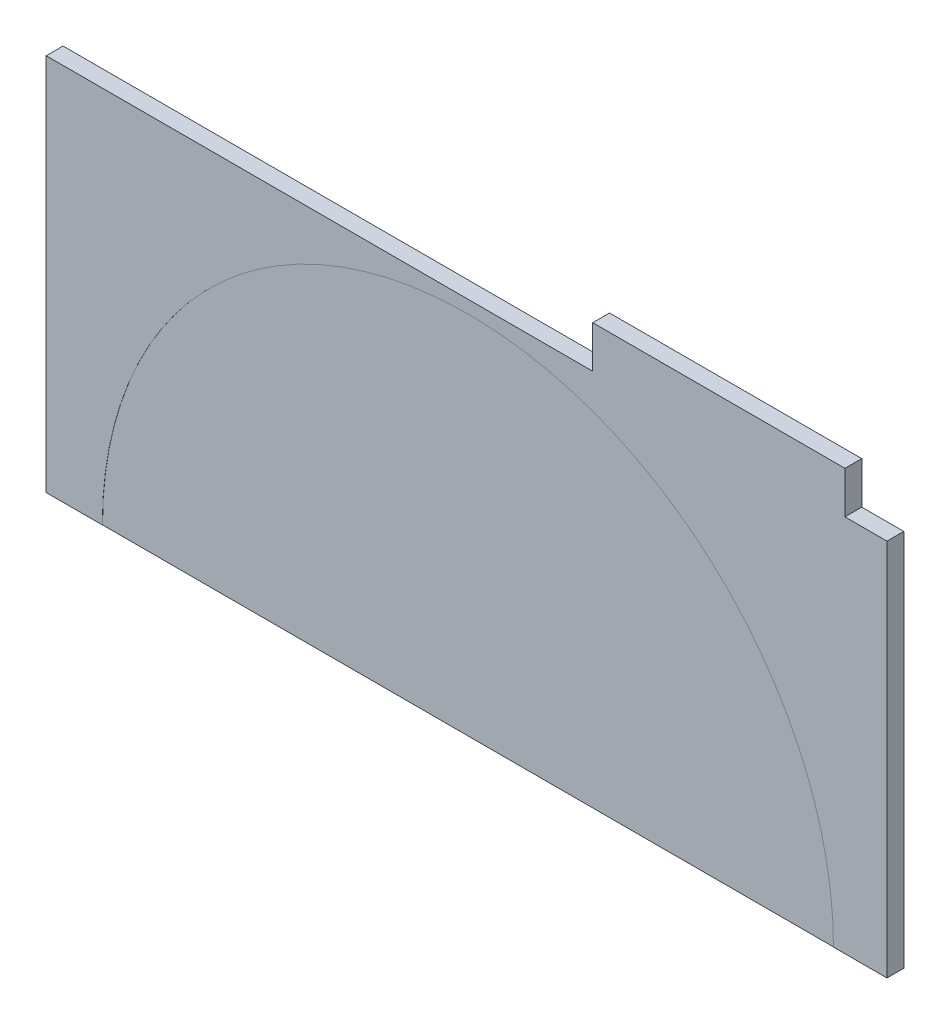
ISO-10303-21;
HEADER;
FILE_DESCRIPTION(('STEP AP214'),'2;1');
FILE_NAME('part.step','',(''),(''),'','','');
FILE_SCHEMA(('AUTOMOTIVE_DESIGN { 1 0 10303 214 1 1 1 1 }'));
ENDSEC;
DATA;
#1=APPLICATION_CONTEXT('core data for automotive mechanical design processes');
#2=APPLICATION_PROTOCOL_DEFINITION('international standard','automotive_design',2000,#1);
#3=PRODUCT_CONTEXT('',#1,'mechanical');
#4=PRODUCT('Part','Part','',(#3));
#5=PRODUCT_RELATED_PRODUCT_CATEGORY('part','',(#4));
#6=PRODUCT_DEFINITION_FORMATION('','',#4);
#7=PRODUCT_DEFINITION_CONTEXT('part definition',#1,'design');
#8=PRODUCT_DEFINITION('design','',#6,#7);
#9=PRODUCT_DEFINITION_SHAPE('','',#8);
#10=(LENGTH_UNIT() NAMED_UNIT(*) SI_UNIT(.MILLI.,.METRE.));
#11=(NAMED_UNIT(*) PLANE_ANGLE_UNIT() SI_UNIT($,.RADIAN.));
#12=(NAMED_UNIT(*) SI_UNIT($,.STERADIAN.) SOLID_ANGLE_UNIT());
#13=UNCERTAINTY_MEASURE_WITH_UNIT(LENGTH_MEASURE(1.E-05),#10,'distance_accuracy_value','');
#14=(GEOMETRIC_REPRESENTATION_CONTEXT(3) GLOBAL_UNCERTAINTY_ASSIGNED_CONTEXT((#13)) GLOBAL_UNIT_ASSIGNED_CONTEXT((#10,
#11,#12)) REPRESENTATION_CONTEXT('',''));
#15=CARTESIAN_POINT('',(0.,0.,0.));
#16=DIRECTION('',(0.,0.,1.));
#17=DIRECTION('',(1.,0.,0.));
#18=AXIS2_PLACEMENT_3D('',#15,#16,#17);
#19=CARTESIAN_POINT('',(0.,0.,0.19));
#20=DIRECTION('',(0.,0.,-1.));
#21=DIRECTION('',(-1.,0.,0.));
#22=AXIS2_PLACEMENT_3D('',#19,#20,#21);
#23=PLANE('',#22);
#24=CARTESIAN_POINT('',(0.450773361976369,-0.800000000000001,0.19));
#25=DIRECTION('',(0.,0.,1.));
#26=DIRECTION('',(1.,0.,0.));
#27=AXIS2_PLACEMENT_3D('',#24,#25,#26);
#28=CIRCLE('',#27,0.217416756176155);
#29=CARTESIAN_POINT('',(0.668190118152524,-0.800000000000001,0.19));
#30=VERTEX_POINT('',#29);
#31=CARTESIAN_POINT('',(0.233356605800214,-0.800000000000001,0.19));
#32=VERTEX_POINT('',#31);
#33=EDGE_CURVE('E11',#30,#32,#28,.T.);
#34=ORIENTED_EDGE('',*,*,#33,.F.);
#35=DIRECTION('',(-1.,0.,0.));
#36=VECTOR('',#35,1.);
#37=CARTESIAN_POINT('',(0.7,-0.800000000000001,0.19));
#38=LINE('',#37,#36);
#39=CARTESIAN_POINT('',(0.7,-0.800000000000001,0.19));
#40=VERTEX_POINT('',#39);
#41=EDGE_CURVE('E24',#40,#30,#38,.T.);
#42=ORIENTED_EDGE('',*,*,#41,.F.);
#43=DIRECTION('',(0.,-1.,0.));
#44=VECTOR('',#43,1.);
#45=CARTESIAN_POINT('',(0.7,-0.57499996547462,0.19));
#46=LINE('',#45,#44);
#47=CARTESIAN_POINT('',(0.7,-0.57499996547462,0.19));
#48=VERTEX_POINT('',#47);
#49=EDGE_CURVE('E177',#48,#40,#46,.T.);
#50=ORIENTED_EDGE('',*,*,#49,.F.);
#51=DIRECTION('',(1.,0.,0.));
#52=VECTOR('',#51,1.);
#53=CARTESIAN_POINT('',(0.675000034525379,-0.57499996547462,0.19));
#54=LINE('',#53,#52);
#55=CARTESIAN_POINT('',(0.675000034525379,-0.57499996547462,0.19));
#56=VERTEX_POINT('',#55);
#57=EDGE_CURVE('E175',#56,#48,#54,.T.);
#58=ORIENTED_EDGE('',*,*,#57,.F.);
#59=DIRECTION('',(0.,-1.,0.));
#60=VECTOR('',#59,1.);
#61=CARTESIAN_POINT('',(0.675000034525379,-0.55,0.19));
#62=LINE('',#61,#60);
#63=CARTESIAN_POINT('',(0.675000034525379,-0.55,0.19));
#64=VERTEX_POINT('',#63);
#65=EDGE_CURVE('E96',#64,#56,#62,.T.);
#66=ORIENTED_EDGE('',*,*,#65,.F.);
#67=DIRECTION('',(1.,0.,0.));
#68=VECTOR('',#67,1.);
#69=CARTESIAN_POINT('',(0.525000034525379,-0.55,0.19));
#70=LINE('',#69,#68);
#71=CARTESIAN_POINT('',(0.525000034525379,-0.55,0.19));
#72=VERTEX_POINT('',#71);
#73=EDGE_CURVE('E171',#72,#64,#70,.T.);
#74=ORIENTED_EDGE('',*,*,#73,.F.);
#75=DIRECTION('',(0.,1.,0.));
#76=VECTOR('',#75,1.);
#77=CARTESIAN_POINT('',(0.525000034525379,-0.57499996547462,0.19));
#78=LINE('',#77,#76);
#79=CARTESIAN_POINT('',(0.525000034525379,-0.57499996547462,0.19));
#80=VERTEX_POINT('',#79);
#81=EDGE_CURVE('E168',#80,#72,#78,.T.);
#82=ORIENTED_EDGE('',*,*,#81,.F.);
#83=DIRECTION('',(1.,0.,0.));
#84=VECTOR('',#83,1.);
#85=CARTESIAN_POINT('',(0.2,-0.57499996547462,0.19));
#86=LINE('',#85,#84);
#87=CARTESIAN_POINT('',(0.2,-0.57499996547462,0.19));
#88=VERTEX_POINT('',#87);
#89=EDGE_CURVE('E165',#88,#80,#86,.T.);
#90=ORIENTED_EDGE('',*,*,#89,.F.);
#91=DIRECTION('',(0.,1.,0.));
#92=VECTOR('',#91,1.);
#93=CARTESIAN_POINT('',(0.2,-0.800000000000001,0.19));
#94=LINE('',#93,#92);
#95=CARTESIAN_POINT('',(0.2,-0.800000000000001,0.19));
#96=VERTEX_POINT('',#95);
#97=EDGE_CURVE('E162',#96,#88,#94,.T.);
#98=ORIENTED_EDGE('',*,*,#97,.F.);
#99=DIRECTION('',(-1.,0.,0.));
#100=VECTOR('',#99,1.);
#101=CARTESIAN_POINT('',(0.7,-0.800000000000001,0.19));
#102=LINE('',#101,#100);
#103=EDGE_CURVE('E159',#32,#96,#102,.T.);
#104=ORIENTED_EDGE('',*,*,#103,.F.);
#105=EDGE_LOOP('',(#34,#42,#50,#58,#66,#74,#82,#90,#98,#104));
#106=FACE_BOUND('',#105,.T.);
#107=ADVANCED_FACE('F17',(#106),#23,.F.);
#108=CARTESIAN_POINT('',(0.7,-0.57499996547462,0.18));
#109=DIRECTION('',(-1.,0.,0.));
#110=DIRECTION('',(0.,-1.,0.));
#111=AXIS2_PLACEMENT_3D('',#108,#109,#110);
#112=PLANE('',#111);
#113=ORIENTED_EDGE('',*,*,#49,.T.);
#114=DIRECTION('',(0.,0.,1.));
#115=VECTOR('',#114,1.);
#116=CARTESIAN_POINT('',(0.7,-0.800000000000001,0.18));
#117=LINE('',#116,#115);
#118=CARTESIAN_POINT('',(0.7,-0.800000000000001,0.18));
#119=VERTEX_POINT('',#118);
#120=EDGE_CURVE('E156',#119,#40,#117,.T.);
#121=ORIENTED_EDGE('',*,*,#120,.F.);
#122=DIRECTION('',(0.,-1.,0.));
#123=VECTOR('',#122,1.);
#124=CARTESIAN_POINT('',(0.7,-0.57499996547462,0.18));
#125=LINE('',#124,#123);
#126=CARTESIAN_POINT('',(0.7,-0.57499996547462,0.18));
#127=VERTEX_POINT('',#126);
#128=EDGE_CURVE('E154',#127,#119,#125,.T.);
#129=ORIENTED_EDGE('',*,*,#128,.F.);
#130=DIRECTION('',(0.,0.,1.));
#131=VECTOR('',#130,1.);
#132=CARTESIAN_POINT('',(0.7,-0.57499996547462,0.18));
#133=LINE('',#132,#131);
#134=EDGE_CURVE('E114',#127,#48,#133,.T.);
#135=ORIENTED_EDGE('',*,*,#134,.T.);
#136=EDGE_LOOP('',(#113,#121,#129,#135));
#137=FACE_BOUND('',#136,.T.);
#138=ADVANCED_FACE('F199',(#137),#112,.F.);
#139=CARTESIAN_POINT('',(0.7,-0.800000000000001,0.18));
#140=DIRECTION('',(0.,1.,0.));
#141=DIRECTION('',(0.,0.,1.));
#142=AXIS2_PLACEMENT_3D('',#139,#140,#141);
#143=PLANE('',#142);
#144=DIRECTION('',(1.,0.,0.));
#145=VECTOR('',#144,1.);
#146=CARTESIAN_POINT('',(0.233356605800214,-0.800000000000001,0.1899));
#147=LINE('',#146,#145);
#148=CARTESIAN_POINT('',(0.233356605800214,-0.800000000000001,0.1899));
#149=VERTEX_POINT('',#148);
#150=CARTESIAN_POINT('',(0.668190118152524,-0.800000000000001,0.1899));
#151=VERTEX_POINT('',#150);
#152=EDGE_CURVE('E151',#149,#151,#147,.T.);
#153=ORIENTED_EDGE('',*,*,#152,.F.);
#154=DIRECTION('',(0.,0.,1.));
#155=VECTOR('',#154,1.);
#156=CARTESIAN_POINT('',(0.233356605800214,-0.800000000000001,0.1899));
#157=LINE('',#156,#155);
#158=EDGE_CURVE('E148',#149,#32,#157,.T.);
#159=ORIENTED_EDGE('',*,*,#158,.T.);
#160=ORIENTED_EDGE('',*,*,#103,.T.);
#161=DIRECTION('',(0.,0.,1.));
#162=VECTOR('',#161,1.);
#163=CARTESIAN_POINT('',(0.2,-0.800000000000001,0.18));
#164=LINE('',#163,#162);
#165=CARTESIAN_POINT('',(0.2,-0.800000000000001,0.18));
#166=VERTEX_POINT('',#165);
#167=EDGE_CURVE('E145',#166,#96,#164,.T.);
#168=ORIENTED_EDGE('',*,*,#167,.F.);
#169=DIRECTION('',(-1.,0.,0.));
#170=VECTOR('',#169,1.);
#171=CARTESIAN_POINT('',(0.7,-0.800000000000001,0.18));
#172=LINE('',#171,#170);
#173=EDGE_CURVE('E142',#119,#166,#172,.T.);
#174=ORIENTED_EDGE('',*,*,#173,.F.);
#175=ORIENTED_EDGE('',*,*,#120,.T.);
#176=ORIENTED_EDGE('',*,*,#41,.T.);
#177=DIRECTION('',(0.,0.,1.));
#178=VECTOR('',#177,1.);
#179=CARTESIAN_POINT('',(0.668190118152524,-0.800000000000001,0.1899));
#180=LINE('',#179,#178);
#181=EDGE_CURVE('E140',#151,#30,#180,.T.);
#182=ORIENTED_EDGE('',*,*,#181,.F.);
#183=EDGE_LOOP('',(#153,#159,#160,#168,#174,#175,#176,#182));
#184=FACE_BOUND('',#183,.T.);
#185=ADVANCED_FACE('F181',(#184),#143,.F.);
#186=CARTESIAN_POINT('',(0.2,-0.800000000000001,0.18));
#187=DIRECTION('',(1.,0.,0.));
#188=DIRECTION('',(0.,1.,0.));
#189=AXIS2_PLACEMENT_3D('',#186,#187,#188);
#190=PLANE('',#189);
#191=ORIENTED_EDGE('',*,*,#97,.T.);
#192=DIRECTION('',(0.,0.,1.));
#193=VECTOR('',#192,1.);
#194=CARTESIAN_POINT('',(0.2,-0.57499996547462,0.18));
#195=LINE('',#194,#193);
#196=CARTESIAN_POINT('',(0.2,-0.57499996547462,0.18));
#197=VERTEX_POINT('',#196);
#198=EDGE_CURVE('E137',#197,#88,#195,.T.);
#199=ORIENTED_EDGE('',*,*,#198,.F.);
#200=DIRECTION('',(0.,1.,0.));
#201=VECTOR('',#200,1.);
#202=CARTESIAN_POINT('',(0.2,-0.800000000000001,0.18));
#203=LINE('',#202,#201);
#204=EDGE_CURVE('E134',#166,#197,#203,.T.);
#205=ORIENTED_EDGE('',*,*,#204,.F.);
#206=ORIENTED_EDGE('',*,*,#167,.T.);
#207=EDGE_LOOP('',(#191,#199,#205,#206));
#208=FACE_BOUND('',#207,.T.);
#209=ADVANCED_FACE('F189',(#208),#190,.F.);
#210=CARTESIAN_POINT('',(0.2,-0.57499996547462,0.18));
#211=DIRECTION('',(0.,-1.,0.));
#212=DIRECTION('',(1.,0.,0.));
#213=AXIS2_PLACEMENT_3D('',#210,#211,#212);
#214=PLANE('',#213);
#215=ORIENTED_EDGE('',*,*,#89,.T.);
#216=DIRECTION('',(0.,0.,1.));
#217=VECTOR('',#216,1.);
#218=CARTESIAN_POINT('',(0.525000034525379,-0.57499996547462,0.18));
#219=LINE('',#218,#217);
#220=CARTESIAN_POINT('',(0.525000034525379,-0.57499996547462,0.18));
#221=VERTEX_POINT('',#220);
#222=EDGE_CURVE('E131',#221,#80,#219,.T.);
#223=ORIENTED_EDGE('',*,*,#222,.F.);
#224=DIRECTION('',(1.,0.,0.));
#225=VECTOR('',#224,1.);
#226=CARTESIAN_POINT('',(0.2,-0.57499996547462,0.18));
#227=LINE('',#226,#225);
#228=EDGE_CURVE('E128',#197,#221,#227,.T.);
#229=ORIENTED_EDGE('',*,*,#228,.F.);
#230=ORIENTED_EDGE('',*,*,#198,.T.);
#231=EDGE_LOOP('',(#215,#223,#229,#230));
#232=FACE_BOUND('',#231,.T.);
#233=ADVANCED_FACE('F193',(#232),#214,.F.);
#234=CARTESIAN_POINT('',(0.525000034525379,-0.57499996547462,0.18));
#235=DIRECTION('',(1.,0.,0.));
#236=DIRECTION('',(0.,0.,-1.));
#237=AXIS2_PLACEMENT_3D('',#234,#235,#236);
#238=PLANE('',#237);
#239=ORIENTED_EDGE('',*,*,#81,.T.);
#240=DIRECTION('',(0.,0.,1.));
#241=VECTOR('',#240,1.);
#242=CARTESIAN_POINT('',(0.525000034525379,-0.55,0.18));
#243=LINE('',#242,#241);
#244=CARTESIAN_POINT('',(0.525000034525379,-0.55,0.18));
#245=VERTEX_POINT('',#244);
#246=EDGE_CURVE('E125',#245,#72,#243,.T.);
#247=ORIENTED_EDGE('',*,*,#246,.F.);
#248=DIRECTION('',(0.,1.,0.));
#249=VECTOR('',#248,1.);
#250=CARTESIAN_POINT('',(0.525000034525379,-0.57499996547462,0.18));
#251=LINE('',#250,#249);
#252=EDGE_CURVE('E123',#221,#245,#251,.T.);
#253=ORIENTED_EDGE('',*,*,#252,.F.);
#254=ORIENTED_EDGE('',*,*,#222,.T.);
#255=EDGE_LOOP('',(#239,#247,#253,#254));
#256=FACE_BOUND('',#255,.T.);
#257=ADVANCED_FACE('F195',(#256),#238,.F.);
#258=CARTESIAN_POINT('',(0.525000034525379,-0.55,0.18));
#259=DIRECTION('',(0.,-1.,0.));
#260=DIRECTION('',(0.,0.,-1.));
#261=AXIS2_PLACEMENT_3D('',#258,#259,#260);
#262=PLANE('',#261);
#263=ORIENTED_EDGE('',*,*,#73,.T.);
#264=DIRECTION('',(0.,0.,1.));
#265=VECTOR('',#264,1.);
#266=CARTESIAN_POINT('',(0.675000034525379,-0.55,0.18));
#267=LINE('',#266,#265);
#268=CARTESIAN_POINT('',(0.675000034525379,-0.55,0.18));
#269=VERTEX_POINT('',#268);
#270=EDGE_CURVE('E121',#269,#64,#267,.T.);
#271=ORIENTED_EDGE('',*,*,#270,.F.);
#272=DIRECTION('',(1.,0.,0.));
#273=VECTOR('',#272,1.);
#274=CARTESIAN_POINT('',(0.525000034525379,-0.55,0.18));
#275=LINE('',#274,#273);
#276=EDGE_CURVE('E100',#245,#269,#275,.T.);
#277=ORIENTED_EDGE('',*,*,#276,.F.);
#278=ORIENTED_EDGE('',*,*,#246,.T.);
#279=EDGE_LOOP('',(#263,#271,#277,#278));
#280=FACE_BOUND('',#279,.T.);
#281=ADVANCED_FACE('F197',(#280),#262,.F.);
#282=CARTESIAN_POINT('',(0.675000034525379,-0.55,0.18));
#283=DIRECTION('',(-1.,0.,0.));
#284=DIRECTION('',(0.,0.,1.));
#285=AXIS2_PLACEMENT_3D('',#282,#283,#284);
#286=PLANE('',#285);
#287=ORIENTED_EDGE('',*,*,#65,.T.);
#288=DIRECTION('',(0.,0.,1.));
#289=VECTOR('',#288,1.);
#290=CARTESIAN_POINT('',(0.675000034525379,-0.57499996547462,0.18));
#291=LINE('',#290,#289);
#292=CARTESIAN_POINT('',(0.675000034525379,-0.57499996547462,0.18));
#293=VERTEX_POINT('',#292);
#294=EDGE_CURVE('E91',#293,#56,#291,.T.);
#295=ORIENTED_EDGE('',*,*,#294,.F.);
#296=DIRECTION('',(0.,-1.,0.));
#297=VECTOR('',#296,1.);
#298=CARTESIAN_POINT('',(0.675000034525379,-0.55,0.18));
#299=LINE('',#298,#297);
#300=EDGE_CURVE('E95',#269,#293,#299,.T.);
#301=ORIENTED_EDGE('',*,*,#300,.F.);
#302=ORIENTED_EDGE('',*,*,#270,.T.);
#303=EDGE_LOOP('',(#287,#295,#301,#302));
#304=FACE_BOUND('',#303,.T.);
#305=ADVANCED_FACE('F93',(#304),#286,.F.);
#306=CARTESIAN_POINT('',(0.675000034525379,-0.57499996547462,0.18));
#307=DIRECTION('',(0.,-1.,0.));
#308=DIRECTION('',(0.,0.,-1.));
#309=AXIS2_PLACEMENT_3D('',#306,#307,#308);
#310=PLANE('',#309);
#311=ORIENTED_EDGE('',*,*,#57,.T.);
#312=ORIENTED_EDGE('',*,*,#134,.F.);
#313=DIRECTION('',(1.,0.,0.));
#314=VECTOR('',#313,1.);
#315=CARTESIAN_POINT('',(0.675000034525379,-0.57499996547462,0.18));
#316=LINE('',#315,#314);
#317=EDGE_CURVE('E107',#293,#127,#316,.T.);
#318=ORIENTED_EDGE('',*,*,#317,.F.);
#319=ORIENTED_EDGE('',*,*,#294,.T.);
#320=EDGE_LOOP('',(#311,#312,#318,#319));
#321=FACE_BOUND('',#320,.T.);
#322=ADVANCED_FACE('F112',(#321),#310,.F.);
#323=CARTESIAN_POINT('',(0.,0.,0.18));
#324=DIRECTION('',(0.,0.,-1.));
#325=DIRECTION('',(-1.,0.,0.));
#326=AXIS2_PLACEMENT_3D('',#323,#324,#325);
#327=PLANE('',#326);
#328=ORIENTED_EDGE('',*,*,#128,.T.);
#329=ORIENTED_EDGE('',*,*,#173,.T.);
#330=ORIENTED_EDGE('',*,*,#204,.T.);
#331=ORIENTED_EDGE('',*,*,#228,.T.);
#332=ORIENTED_EDGE('',*,*,#252,.T.);
#333=ORIENTED_EDGE('',*,*,#276,.T.);
#334=ORIENTED_EDGE('',*,*,#300,.T.);
#335=ORIENTED_EDGE('',*,*,#317,.T.);
#336=EDGE_LOOP('',(#328,#329,#330,#331,#332,#333,#334,#335));
#337=FACE_BOUND('',#336,.T.);
#338=ADVANCED_FACE('F106',(#337),#327,.T.);
#339=CARTESIAN_POINT('',(0.450773361976369,-0.800000000000001,0.1899));
#340=DIRECTION('',(0.,0.,1.));
#341=DIRECTION('',(1.,0.,0.));
#342=AXIS2_PLACEMENT_3D('',#339,#340,#341);
#343=CYLINDRICAL_SURFACE('',#342,0.217416756176155);
#344=ORIENTED_EDGE('',*,*,#33,.T.);
#345=ORIENTED_EDGE('',*,*,#158,.F.);
#346=CARTESIAN_POINT('',(0.450773361976369,-0.800000000000001,0.1899));
#347=DIRECTION('',(0.,0.,1.));
#348=DIRECTION('',(1.,0.,0.));
#349=AXIS2_PLACEMENT_3D('',#346,#347,#348);
#350=CIRCLE('',#349,0.217416756176155);
#351=EDGE_CURVE('E115',#151,#149,#350,.T.);
#352=ORIENTED_EDGE('',*,*,#351,.F.);
#353=ORIENTED_EDGE('',*,*,#181,.T.);
#354=EDGE_LOOP('',(#344,#345,#352,#353));
#355=FACE_BOUND('',#354,.T.);
#356=ADVANCED_FACE('F184',(#355),#343,.F.);
#357=CARTESIAN_POINT('',(0.450773361976369,-0.800000000000001,0.1899));
#358=DIRECTION('',(0.,0.,1.));
#359=DIRECTION('',(1.,0.,0.));
#360=AXIS2_PLACEMENT_3D('',#357,#358,#359);
#361=PLANE('',#360);
#362=ORIENTED_EDGE('',*,*,#152,.T.);
#363=ORIENTED_EDGE('',*,*,#351,.T.);
#364=EDGE_LOOP('',(#362,#363));
#365=FACE_BOUND('',#364,.T.);
#366=ADVANCED_FACE('F186',(#365),#361,.T.);
#367=CLOSED_SHELL('',(#107,#138,#185,#209,#233,#257,#281,#305,#322,#338,#356,#366));
#368=MANIFOLD_SOLID_BREP('B1',#367);
#369=ADVANCED_BREP_SHAPE_REPRESENTATION('',(#18,#368),#14);
#370=SHAPE_DEFINITION_REPRESENTATION(#9,#369);
ENDSEC;
END-ISO-10303-21;
